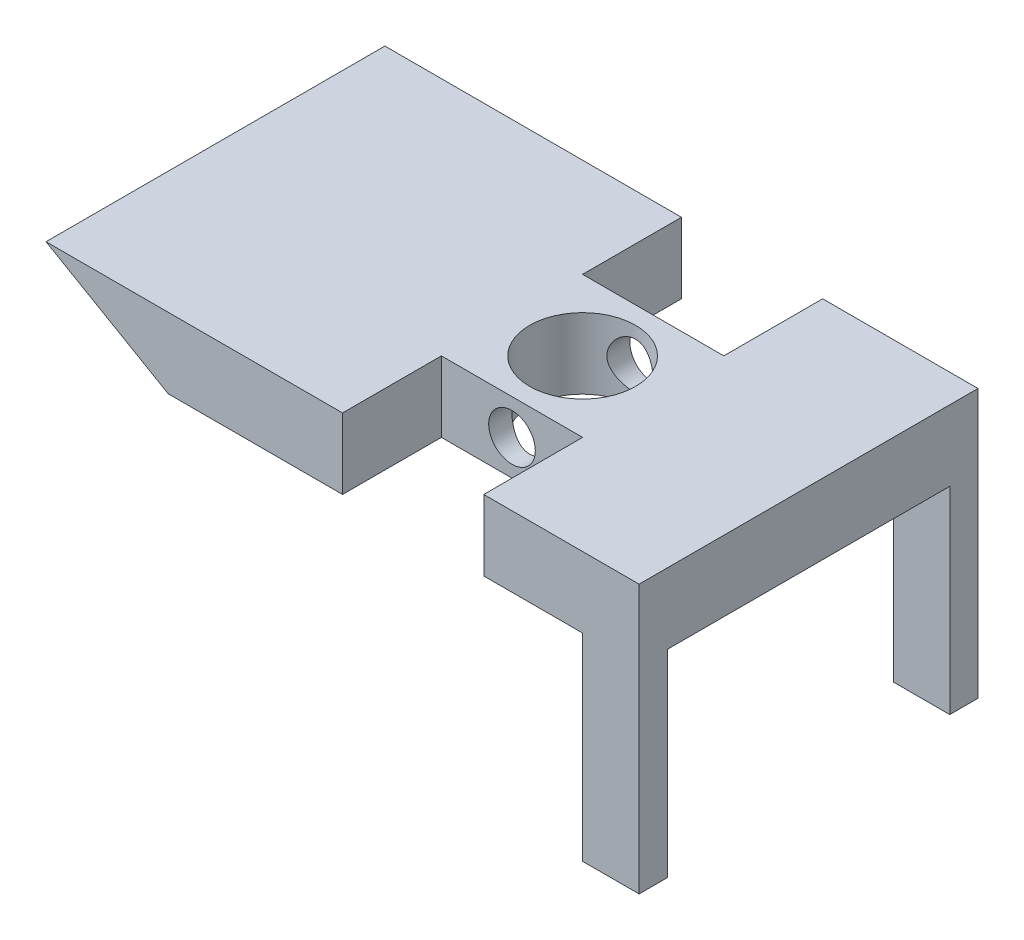
ISO-10303-21;
HEADER;
FILE_DESCRIPTION(('STEP AP214'),'2;1');
FILE_NAME('part.step','',(''),(''),'','','');
FILE_SCHEMA(('AUTOMOTIVE_DESIGN { 1 0 10303 214 1 1 1 1 }'));
ENDSEC;
DATA;
#1=APPLICATION_CONTEXT('core data for automotive mechanical design processes');
#2=APPLICATION_PROTOCOL_DEFINITION('international standard','automotive_design',2000,#1);
#3=PRODUCT_CONTEXT('',#1,'mechanical');
#4=PRODUCT('Part','Part','',(#3));
#5=PRODUCT_RELATED_PRODUCT_CATEGORY('part','',(#4));
#6=PRODUCT_DEFINITION_FORMATION('','',#4);
#7=PRODUCT_DEFINITION_CONTEXT('part definition',#1,'design');
#8=PRODUCT_DEFINITION('design','',#6,#7);
#9=PRODUCT_DEFINITION_SHAPE('','',#8);
#10=(LENGTH_UNIT() NAMED_UNIT(*) SI_UNIT(.MILLI.,.METRE.));
#11=(NAMED_UNIT(*) PLANE_ANGLE_UNIT() SI_UNIT($,.RADIAN.));
#12=(NAMED_UNIT(*) SI_UNIT($,.STERADIAN.) SOLID_ANGLE_UNIT());
#13=UNCERTAINTY_MEASURE_WITH_UNIT(LENGTH_MEASURE(1.E-05),#10,'distance_accuracy_value','');
#14=(GEOMETRIC_REPRESENTATION_CONTEXT(3) GLOBAL_UNCERTAINTY_ASSIGNED_CONTEXT((#13)) GLOBAL_UNIT_ASSIGNED_CONTEXT((#10,
#11,#12)) REPRESENTATION_CONTEXT('',''));
#15=CARTESIAN_POINT('',(0.,0.,0.));
#16=DIRECTION('',(0.,0.,1.));
#17=DIRECTION('',(1.,0.,0.));
#18=AXIS2_PLACEMENT_3D('',#15,#16,#17);
#19=CARTESIAN_POINT('',(17.,-16.5,-26.560219778561));
#20=DIRECTION('',(-1.,0.,0.));
#21=DIRECTION('',(0.,-1.,0.));
#22=AXIS2_PLACEMENT_3D('',#19,#20,#21);
#23=PLANE('',#22);
#24=DIRECTION('',(0.,1.,0.));
#25=VECTOR('',#24,1.);
#26=CARTESIAN_POINT('',(17.,-16.5,10.));
#27=LINE('',#26,#25);
#28=CARTESIAN_POINT('',(17.,-16.5,10.));
#29=VERTEX_POINT('',#28);
#30=CARTESIAN_POINT('',(17.,-2.50000000000001,10.));
#31=VERTEX_POINT('',#30);
#32=EDGE_CURVE('E262',#29,#31,#27,.T.);
#33=ORIENTED_EDGE('',*,*,#32,.F.);
#34=DIRECTION('',(0.,0.,1.));
#35=VECTOR('',#34,1.);
#36=CARTESIAN_POINT('',(17.,-16.5,-26.560219778561));
#37=LINE('',#36,#35);
#38=CARTESIAN_POINT('',(17.,-16.5,12.));
#39=VERTEX_POINT('',#38);
#40=EDGE_CURVE('E189',#29,#39,#37,.T.);
#41=ORIENTED_EDGE('',*,*,#40,.T.);
#42=DIRECTION('',(0.,-1.,0.));
#43=VECTOR('',#42,1.);
#44=CARTESIAN_POINT('',(17.,-16.5,12.));
#45=LINE('',#44,#43);
#46=CARTESIAN_POINT('',(17.,-2.50000000000001,12.));
#47=VERTEX_POINT('',#46);
#48=EDGE_CURVE('E264',#47,#39,#45,.T.);
#49=ORIENTED_EDGE('',*,*,#48,.F.);
#50=DIRECTION('',(0.,0.,1.));
#51=VECTOR('',#50,1.);
#52=CARTESIAN_POINT('',(17.,-2.50000000000001,-26.560219778561));
#53=LINE('',#52,#51);
#54=EDGE_CURVE('E69',#31,#47,#53,.T.);
#55=ORIENTED_EDGE('',*,*,#54,.F.);
#56=EDGE_LOOP('',(#33,#41,#49,#55));
#57=FACE_BOUND('',#56,.T.);
#58=ADVANCED_FACE('F45',(#57),#23,.T.);
#59=CARTESIAN_POINT('',(21.,-16.5,-26.560219778561));
#60=DIRECTION('',(0.,-1.,0.));
#61=DIRECTION('',(1.,0.,0.));
#62=AXIS2_PLACEMENT_3D('',#59,#60,#61);
#63=PLANE('',#62);
#64=DIRECTION('',(-1.,0.,0.));
#65=VECTOR('',#64,1.);
#66=CARTESIAN_POINT('',(21.,-16.5,10.));
#67=LINE('',#66,#65);
#68=CARTESIAN_POINT('',(21.,-16.5,10.));
#69=VERTEX_POINT('',#68);
#70=EDGE_CURVE('E11',#69,#29,#67,.T.);
#71=ORIENTED_EDGE('',*,*,#70,.F.);
#72=DIRECTION('',(0.,0.,1.));
#73=VECTOR('',#72,1.);
#74=CARTESIAN_POINT('',(21.,-16.5,-26.560219778561));
#75=LINE('',#74,#73);
#76=CARTESIAN_POINT('',(21.,-16.5,12.));
#77=VERTEX_POINT('',#76);
#78=EDGE_CURVE('E187',#69,#77,#75,.T.);
#79=ORIENTED_EDGE('',*,*,#78,.T.);
#80=DIRECTION('',(1.,0.,0.));
#81=VECTOR('',#80,1.);
#82=CARTESIAN_POINT('',(21.,-16.5,12.));
#83=LINE('',#82,#81);
#84=EDGE_CURVE('E269',#39,#77,#83,.T.);
#85=ORIENTED_EDGE('',*,*,#84,.F.);
#86=ORIENTED_EDGE('',*,*,#40,.F.);
#87=EDGE_LOOP('',(#71,#79,#85,#86));
#88=FACE_BOUND('',#87,.T.);
#89=ADVANCED_FACE('F185',(#88),#63,.T.);
#90=CARTESIAN_POINT('',(5.,0.,-12.001));
#91=DIRECTION('',(0.,0.,1.));
#92=DIRECTION('',(1.,0.,0.));
#93=AXIS2_PLACEMENT_3D('',#90,#91,#92);
#94=CYLINDRICAL_SURFACE('',#93,1.65);
#95=CARTESIAN_POINT('',(6.65,0.,-3.36749164809655));
#96=CARTESIAN_POINT('',(6.64999591948725,-0.0874743691332364,-3.36749607292385));
#97=CARTESIAN_POINT('',(6.64299960015496,-0.175092773934502,-3.37094939684784));
#98=CARTESIAN_POINT('',(6.61531716545798,-0.34775711686566,-3.38429832583538));
#99=CARTESIAN_POINT('',(6.59459592274656,-0.43279586708638,-3.39421046041475));
#100=CARTESIAN_POINT('',(6.54044870220548,-0.597493099250667,-3.41912171212209));
#101=CARTESIAN_POINT('',(6.50707857419381,-0.677173445386281,-3.43409843617774));
#102=CARTESIAN_POINT('',(6.42874832845569,-0.829783884986508,-3.46741736925901));
#103=CARTESIAN_POINT('',(6.38379002894348,-0.902715034980057,-3.48575905018413));
#104=CARTESIAN_POINT('',(6.28021734567749,-1.04487154765315,-3.52516638479344));
#105=CARTESIAN_POINT('',(6.22091990046756,-1.11357209474114,-3.54633091062051));
#106=CARTESIAN_POINT('',(6.09178303274802,-1.24044684009399,-3.5881911575404));
#107=CARTESIAN_POINT('',(6.02193928529622,-1.29861669819959,-3.60888668227713));
#108=CARTESIAN_POINT('',(5.86946484491625,-1.40556708343849,-3.64870271327509));
#109=CARTESIAN_POINT('',(5.78637319615618,-1.45374252984986,-3.66769507829858));
#110=CARTESIAN_POINT('',(5.61227632392994,-1.53520034882064,-3.700736202455));
#111=CARTESIAN_POINT('',(5.52127502438018,-1.5684900562803,-3.71478739560396));
#112=CARTESIAN_POINT('',(5.3394662745173,-1.61728382118504,-3.73565913311448));
#113=CARTESIAN_POINT('',(5.24894589824284,-1.63369687425848,-3.74284752867496));
#114=CARTESIAN_POINT('',(5.06617018053506,-1.65122350001048,-3.75052967187645));
#115=CARTESIAN_POINT('',(4.97391564874558,-1.65234404312534,-3.75102646959465));
#116=CARTESIAN_POINT('',(4.79695735459994,-1.63969762210196,-3.74547519866295));
#117=CARTESIAN_POINT('',(4.71216534970809,-1.6269337501266,-3.739868091581));
#118=CARTESIAN_POINT('',(4.5460705321449,-1.58862001141631,-3.72336083389609));
#119=CARTESIAN_POINT('',(4.46476797823857,-1.56306919822083,-3.71246029148675));
#120=CARTESIAN_POINT('',(4.30645273442336,-1.49962622377595,-3.68619520386884));
#121=CARTESIAN_POINT('',(4.22952453920683,-1.46155151512836,-3.67076501619212));
#122=CARTESIAN_POINT('',(4.08294686925941,-1.37433410623966,-3.63691910801703));
#123=CARTESIAN_POINT('',(4.01330005270581,-1.32518738450648,-3.6185023034251));
#124=CARTESIAN_POINT('',(3.87753504589473,-1.21281701199709,-3.57882020061428));
#125=CARTESIAN_POINT('',(3.81210572269681,-1.14879890575554,-3.5574447595915));
#126=CARTESIAN_POINT('',(3.69259260075723,-1.01070787762528,-3.51528240579217));
#127=CARTESIAN_POINT('',(3.63851423294623,-0.936630170451252,-3.49449577883282));
#128=CARTESIAN_POINT('',(3.54117220405855,-0.776800460066391,-3.45502479534648));
#129=CARTESIAN_POINT('',(3.49843008891747,-0.690699088400833,-3.43645839327868));
#130=CARTESIAN_POINT('',(3.42834028609234,-0.511490455495722,-3.40497856582965));
#131=CARTESIAN_POINT('',(3.40098013157646,-0.418388937355618,-3.39206056440346));
#132=CARTESIAN_POINT('',(3.36429227707904,-0.234744535363253,-3.37451456223478));
#133=CARTESIAN_POINT('',(3.35383875555708,-0.14447698815772,-3.36937064835984));
#134=CARTESIAN_POINT('',(3.34792333452705,0.0366498278836478,-3.36647574871939));
#135=CARTESIAN_POINT('',(3.35245516573098,0.127508833402355,-3.36872167133213));
#136=CARTESIAN_POINT('',(3.37535174013094,0.300038323378446,-3.37981562096985));
#137=CARTESIAN_POINT('',(3.39265374352297,0.381886932345077,-3.3881559621082));
#138=CARTESIAN_POINT('',(3.43914744636585,0.541431160999637,-3.40982287754369));
#139=CARTESIAN_POINT('',(3.46834214737761,0.619125726657332,-3.42315071054923));
#140=CARTESIAN_POINT('',(3.53921629690324,0.772027463841052,-3.45400682275722));
#141=CARTESIAN_POINT('',(3.58139272921155,0.846970827739329,-3.47169539316014));
#142=CARTESIAN_POINT('',(3.6765572613445,0.989101543315081,-3.50907546279441));
#143=CARTESIAN_POINT('',(3.72955038819797,1.05628526590527,-3.5287678911715));
#144=CARTESIAN_POINT('',(3.85062358980462,1.18748477509611,-3.57013856276202));
#145=CARTESIAN_POINT('',(3.9196470398001,1.25062896923803,-3.59183160476859));
#146=CARTESIAN_POINT('',(4.06778238636593,1.36462621623268,-3.63309467060809));
#147=CARTESIAN_POINT('',(4.14689558402023,1.41547768147165,-3.65266442003673));
#148=CARTESIAN_POINT('',(4.31400673932617,1.50362813045694,-3.68771558350776));
#149=CARTESIAN_POINT('',(4.40206664806587,1.54082304607772,-3.70316536765515));
#150=CARTESIAN_POINT('',(4.58405684732281,1.59956776607057,-3.72798894821772));
#151=CARTESIAN_POINT('',(4.6779831509097,1.62112807306508,-3.73736682301229));
#152=CARTESIAN_POINT('',(4.8612978165453,1.64656089333974,-3.74847245839303));
#153=CARTESIAN_POINT('',(4.95048512527525,1.65165818539736,-3.75072963755332));
#154=CARTESIAN_POINT('',(5.12843486064658,1.64739798838615,-3.74885512685435));
#155=CARTESIAN_POINT('',(5.21719737386056,1.63804358240265,-3.74472479968784));
#156=CARTESIAN_POINT('',(5.38782932587362,1.60602123171463,-3.7308324127445));
#157=CARTESIAN_POINT('',(5.46983114363675,1.58394115377817,-3.72131934376771));
#158=CARTESIAN_POINT('',(5.62890956243098,1.5277736246503,-3.69776205916142));
#159=CARTESIAN_POINT('',(5.70598528433432,1.493684037231,-3.68371703743449));
#160=CARTESIAN_POINT('',(5.8569304617613,1.41274147649753,-3.65162935021383));
#161=CARTESIAN_POINT('',(5.93049119711801,1.36537526372791,-3.63343300227536));
#162=CARTESIAN_POINT('',(6.06894266820481,1.25993695077241,-3.59513976322226));
#163=CARTESIAN_POINT('',(6.13382977719905,1.20186039623367,-3.57504208305736));
#164=CARTESIAN_POINT('',(6.25831260974055,1.07139703994961,-3.53324031823005));
#165=CARTESIAN_POINT('',(6.31711532685678,0.998252385431584,-3.51153178279635));
#166=CARTESIAN_POINT('',(6.42177534917193,0.842529476107379,-3.47047923678989));
#167=CARTESIAN_POINT('',(6.46762474174623,0.759945498298514,-3.45113667556083));
#168=CARTESIAN_POINT('',(6.5449162136947,0.587124299309078,-3.41723991894323));
#169=CARTESIAN_POINT('',(6.57632700235197,0.496870953906539,-3.40269614232787));
#170=CARTESIAN_POINT('',(6.62309555077018,0.311643517725821,-3.38064338773551));
#171=CARTESIAN_POINT('',(6.6385071714776,0.216686400884639,-3.3731108155642));
#172=CARTESIAN_POINT('',(6.64703108329939,0.100998496777651,-3.36894448238601));
#173=CARTESIAN_POINT('',(6.64814335262455,0.0808209970433329,-3.36840080987488));
#174=CARTESIAN_POINT('',(6.64962829144477,0.0404315640214873,-3.36767387701191));
#175=CARTESIAN_POINT('',(6.65000094320723,0.0202196299200109,-3.36749062530128));
#176=CARTESIAN_POINT('',(6.65,0.,-3.36749164809655));
#177=B_SPLINE_CURVE_WITH_KNOTS('',3,(#95,#96,#97,#98,#99,#100,#101,#102,#103,#104,#105,#106,
#107,#108,#109,#110,#111,#112,#113,#114,#115,#116,#117,#118,#119,#120,#121,#122,#123,#124,#125,
#126,#127,#128,#129,#130,#131,#132,#133,#134,#135,#136,#137,#138,#139,#140,#141,#142,#143,#144,
#145,#146,#147,#148,#149,#150,#151,#152,#153,#154,#155,#156,#157,#158,#159,#160,#161,#162,#163,
#164,#165,#166,#167,#168,#169,#170,#171,#172,#173,#174,#175,#176),.UNSPECIFIED.,.T.,.F.,(4,2,2,
2,2,2,2,2,2,2,2,2,2,2,2,2,2,2,2,2,2,2,2,2,2,2,2,2,2,2,2,2,2,2,2,2,2,2,2,2,4),(0.,
0.262337992001349,0.525350015511181,0.787214015160155,1.04903695265107,1.32739302247777,
1.60586355517072,1.89807751150631,2.19014732125288,2.46549872058573,2.74072460857159,
2.99731128459009,3.25391695538524,3.51444216606865,3.77506215572741,4.05582705551463,
4.336725984226,4.62890596840992,4.92084880275994,5.1924046605751,5.46384692437079,
5.71493513596501,5.96608675823259,6.22839495294345,6.49082533337074,6.77759301230099,
7.06439770769602,7.35334470453729,7.64209741960136,7.90880391080322,8.17545351143564,
8.43067328899048,8.68593848747794,8.95289970595717,9.21997220307097,9.50762420315226,
9.79545153931286,10.0838997352209,10.371373694431,10.4320114560409,10.4926506714452),.UNSPECIFIED.);
#178=CARTESIAN_POINT('',(6.65,0.,-3.36749164809655));
#179=VERTEX_POINT('',#178);
#180=EDGE_CURVE('E221',#179,#179,#177,.T.);
#181=ORIENTED_EDGE('',*,*,#180,.F.);
#182=EDGE_LOOP('',(#181));
#183=FACE_BOUND('',#182,.T.);
#184=CARTESIAN_POINT('',(5.,0.,-5.));
#185=DIRECTION('',(0.,0.,1.));
#186=DIRECTION('',(1.,0.,0.));
#187=AXIS2_PLACEMENT_3D('',#184,#185,#186);
#188=CIRCLE('',#187,1.65);
#189=CARTESIAN_POINT('',(6.65,0.,-5.));
#190=VERTEX_POINT('',#189);
#191=EDGE_CURVE('E398',#190,#190,#188,.T.);
#192=ORIENTED_EDGE('',*,*,#191,.F.);
#193=EDGE_LOOP('',(#192));
#194=FACE_BOUND('',#193,.T.);
#195=ADVANCED_FACE('F261',(#183,#194),#94,.F.);
#196=CARTESIAN_POINT('',(5.,-1.64999999999999,3.75));
#197=CARTESIAN_POINT('',(5.08794065243915,-1.6499960382256,3.74999677525689));
#198=CARTESIAN_POINT('',(5.17602118872723,-1.64292811014753,3.7468719189208));
#199=CARTESIAN_POINT('',(5.34965330491862,-1.61493414299231,3.734683166008));
#200=CARTESIAN_POINT('',(5.43519818666942,-1.59397431770862,3.72560479056562));
#201=CARTESIAN_POINT('',(5.60097235797528,-1.53913128450559,3.70247374212791));
#202=CARTESIAN_POINT('',(5.68121929706646,-1.50529382267499,3.68843868963418));
#203=CARTESIAN_POINT('',(5.83481096834596,-1.42585820871191,3.65674015300381));
#204=CARTESIAN_POINT('',(5.90815735131847,-1.38026287916685,3.63907753990429));
#205=CARTESIAN_POINT('',(6.05000163649843,-1.27598104842034,3.60078615738986));
#206=CARTESIAN_POINT('',(6.1180736642644,-1.21675391782858,3.58005322837619));
#207=CARTESIAN_POINT('',(6.2436925761984,-1.08803679555133,3.53837779505836));
#208=CARTESIAN_POINT('',(6.30123331014303,-1.01854084946944,3.51743517577732));
#209=CARTESIAN_POINT('',(6.40737198125606,-0.866527492523985,3.47638120662905));
#210=CARTESIAN_POINT('',(6.45528386928225,-0.783497192018419,3.45638307676996));
#211=CARTESIAN_POINT('',(6.53627172599083,-0.609555260312099,3.4211597332649));
#212=CARTESIAN_POINT('',(6.5693561919984,-0.51864817889095,3.40593178742375));
#213=CARTESIAN_POINT('',(6.61794121689661,-0.336431274272974,3.3831135312385));
#214=CARTESIAN_POINT('',(6.63426566626132,-0.24538750145579,3.37516767353209));
#215=CARTESIAN_POINT('',(6.65143054751147,-0.061533346194549,3.3668053594707));
#216=CARTESIAN_POINT('',(6.65228100759649,0.0312758530848601,3.36638402671406));
#217=CARTESIAN_POINT('',(6.63908919688508,0.207355873544236,3.37282106403821));
#218=CARTESIAN_POINT('',(6.62634141864489,0.290751689794511,3.37904671722602));
#219=CARTESIAN_POINT('',(6.58850520692874,0.454071225614284,3.39699646382115));
#220=CARTESIAN_POINT('',(6.56341407162607,0.533994180841903,3.40872176101459));
#221=CARTESIAN_POINT('',(6.50110649630304,0.690226926082295,3.43662073577462));
#222=CARTESIAN_POINT('',(6.46363227970243,0.766416489003962,3.45288773136686));
#223=CARTESIAN_POINT('',(6.37780710670808,0.911743878376047,3.48802159021638));
#224=CARTESIAN_POINT('',(6.32945161231713,0.98087874515625,3.50688953691532));
#225=CARTESIAN_POINT('',(6.21783776896922,1.11706798335261,3.54728261097474));
#226=CARTESIAN_POINT('',(6.15359849475329,1.18329659100237,3.56888963165699));
#227=CARTESIAN_POINT('',(6.01473808953318,1.30433611063187,3.61082599340459));
#228=CARTESIAN_POINT('',(5.94011395212262,1.35914370472461,3.63115496199219));
#229=CARTESIAN_POINT('',(5.77984544173489,1.4571919003997,3.66896451776514));
#230=CARTESIAN_POINT('',(5.69394811565675,1.50005943159357,3.68634771561839));
#231=CARTESIAN_POINT('',(5.51519989197507,1.57043908051861,3.71554130843415));
#232=CARTESIAN_POINT('',(5.42235333017465,1.59796068385572,3.72735514522372));
#233=CARTESIAN_POINT('',(5.23921022750967,1.63505304083378,3.74341295596741));
#234=CARTESIAN_POINT('',(5.14917854061996,1.64572966452199,3.74812228788192));
#235=CARTESIAN_POINT('',(4.96849247665594,1.65217171911426,3.75095455785044));
#236=CARTESIAN_POINT('',(4.87783831540074,1.64794208106069,3.74907967398628));
#237=CARTESIAN_POINT('',(4.70390665287527,1.62544881834209,3.73925037459651));
#238=CARTESIAN_POINT('',(4.62050230959725,1.60799437581935,3.73164663418775));
#239=CARTESIAN_POINT('',(4.45791706209694,1.56071027218964,3.71151728629914));
#240=CARTESIAN_POINT('',(4.37873667607145,1.5308790966223,3.69899107649862));
#241=CARTESIAN_POINT('',(4.22404079862631,1.45873229578338,3.66971134498956));
#242=CARTESIAN_POINT('',(4.14871703627141,1.41605581574278,3.65283800179973));
#243=CARTESIAN_POINT('',(4.00602810222664,1.31982329381418,3.61662102234894));
#244=CARTESIAN_POINT('',(3.93866640117434,1.26626253496258,3.5972763164179));
#245=CARTESIAN_POINT('',(3.80819611837273,1.14484038573233,3.55628214760162));
#246=CARTESIAN_POINT('',(3.74584598439284,1.07618271743489,3.53457144282308));
#247=CARTESIAN_POINT('',(3.63330445356358,0.929097206857137,3.49260064747062));
#248=CARTESIAN_POINT('',(3.58311709508679,0.850666132592157,3.47234104026914));
#249=CARTESIAN_POINT('',(3.49540307748589,0.683921591275967,3.43526035744153));
#250=CARTESIAN_POINT('',(3.45817723591055,0.595429542818641,3.4185241503665));
#251=CARTESIAN_POINT('',(3.39950438017547,0.412456963898673,3.39145640297362));
#252=CARTESIAN_POINT('',(3.37804232181517,0.317982236816925,3.38111875766089));
#253=CARTESIAN_POINT('',(3.35307874998712,0.134229339541123,3.36902436868046));
#254=CARTESIAN_POINT('',(3.34822601990919,0.0451768053067911,3.36662264808986));
#255=CARTESIAN_POINT('',(3.35292803694661,-0.132443324028015,3.36892598901368));
#256=CARTESIAN_POINT('',(3.36247987258739,-0.221011013494947,3.37362961438418));
#257=CARTESIAN_POINT('',(3.39454415171674,-0.389834130472378,3.38899632048544));
#258=CARTESIAN_POINT('',(3.41627535473376,-0.470274087988884,3.39929913530275));
#259=CARTESIAN_POINT('',(3.4712672768033,-0.626361280798586,3.42438089295876));
#260=CARTESIAN_POINT('',(3.50453131275969,-0.702007129869665,3.43916112337134));
#261=CARTESIAN_POINT('',(3.58406507679427,-0.851619735953297,3.47269356886383));
#262=CARTESIAN_POINT('',(3.63102681157857,-0.925174495154689,3.49163847278619));
#263=CARTESIAN_POINT('',(3.7357127896172,-1.06377992281055,3.53089238653571));
#264=CARTESIAN_POINT('',(3.79344141213049,-1.12882711256768,3.55120194925799));
#265=CARTESIAN_POINT('',(3.92382903951875,-1.25428003578286,3.59296880703805));
#266=CARTESIAN_POINT('',(3.99734015606778,-1.31382091586416,3.6143768693599));
#267=CARTESIAN_POINT('',(4.15406955877593,-1.41980560454865,3.65423468677977));
#268=CARTESIAN_POINT('',(4.23729223810856,-1.46624345307614,3.67268309400139));
#269=CARTESIAN_POINT('',(4.41023740744423,-1.54387701756613,3.70436408768263));
#270=CARTESIAN_POINT('',(4.49986734754799,-1.57525320509646,3.71765804406783));
#271=CARTESIAN_POINT('',(4.68371482188615,-1.62216171678276,3.73777368374933));
#272=CARTESIAN_POINT('',(4.77791736039553,-1.63774259010251,3.74461519501638));
#273=CARTESIAN_POINT('',(4.89387606102141,-1.64672172070878,3.7485588513459));
#274=CARTESIAN_POINT('',(4.91507632147087,-1.64794995964318,3.74909837906909));
#275=CARTESIAN_POINT('',(4.95751499929637,-1.6495895819625,3.74981934473969));
#276=CARTESIAN_POINT('',(4.97875341705226,-1.65000095717015,3.75000077910238));
#277=CARTESIAN_POINT('',(5.,-1.64999999999999,3.75));
#278=B_SPLINE_CURVE_WITH_KNOTS('',3,(#196,#197,#198,#199,#200,#201,#202,#203,#204,#205,#206,
#207,#208,#209,#210,#211,#212,#213,#214,#215,#216,#217,#218,#219,#220,#221,#222,#223,#224,#225,
#226,#227,#228,#229,#230,#231,#232,#233,#234,#235,#236,#237,#238,#239,#240,#241,#242,#243,#244,
#245,#246,#247,#248,#249,#250,#251,#252,#253,#254,#255,#256,#257,#258,#259,#260,#261,#262,#263,
#264,#265,#266,#267,#268,#269,#270,#271,#272,#273,#274,#275,#276,#277),.UNSPECIFIED.,.T.,.F.,(4,
2,2,2,2,2,2,2,2,2,2,2,2,2,2,2,2,2,2,2,2,2,2,2,2,2,2,2,2,2,2,2,2,2,2,2,2,2,2,2,4),(0.,
0.263734510147989,0.528112809050451,0.791560575603076,1.05494515780488,1.33150079465859,
1.60821742685178,1.90051649596436,2.19264783893791,2.46960925800041,2.74639118079142,
2.99899429642278,3.25165272874969,3.50994222706956,3.76833964437948,4.05135561937526,
4.33445369828947,4.62559874662744,4.91656363268483,5.18748705235547,5.45832085804592,
5.71380105020368,5.96931251303603,6.23280504553125,6.49641201330446,6.78088013255853,
7.06544257396593,7.35622693243307,7.64673341835486,7.91295937269032,8.17913152420861,
8.42991502344918,8.68077070926695,8.94756356427704,9.21446517058845,9.50405959505639,
9.79378553355286,10.0799474542432,10.3652271238324,10.4289451074685,10.4926637289549),.UNSPECIFIED.);
#279=CARTESIAN_POINT('',(5.,-1.64999999999999,3.75));
#280=VERTEX_POINT('',#279);
#281=EDGE_CURVE('E230',#280,#280,#278,.T.);
#282=ORIENTED_EDGE('',*,*,#281,.F.);
#283=EDGE_LOOP('',(#282));
#284=FACE_BOUND('',#283,.T.);
#285=CARTESIAN_POINT('',(5.,0.,5.));
#286=DIRECTION('',(0.,0.,1.));
#287=DIRECTION('',(1.,0.,0.));
#288=AXIS2_PLACEMENT_3D('',#285,#286,#287);
#289=CIRCLE('',#288,1.65);
#290=CARTESIAN_POINT('',(6.65,0.,5.));
#291=VERTEX_POINT('',#290);
#292=EDGE_CURVE('E357',#291,#291,#289,.T.);
#293=ORIENTED_EDGE('',*,*,#292,.T.);
#294=EDGE_LOOP('',(#293));
#295=FACE_BOUND('',#294,.T.);
#296=ADVANCED_FACE('F420',(#284,#295),#94,.F.);
#297=CARTESIAN_POINT('',(-21.,2.50000000000001,12.));
#298=DIRECTION('',(0.,-1.,0.));
#299=DIRECTION('',(1.,0.,0.));
#300=AXIS2_PLACEMENT_3D('',#297,#298,#299);
#301=PLANE('',#300);
#302=CARTESIAN_POINT('',(5.,2.5,0.));
#303=DIRECTION('',(0.,1.,0.));
#304=DIRECTION('',(0.,0.,1.));
#305=AXIS2_PLACEMENT_3D('',#302,#303,#304);
#306=CIRCLE('',#305,3.75);
#307=CARTESIAN_POINT('',(5.,2.5,3.75));
#308=VERTEX_POINT('',#307);
#309=EDGE_CURVE('E213',#308,#308,#306,.T.);
#310=ORIENTED_EDGE('',*,*,#309,.F.);
#311=EDGE_LOOP('',(#310));
#312=FACE_BOUND('',#311,.T.);
#313=DIRECTION('',(0.,0.,-1.));
#314=VECTOR('',#313,1.);
#315=CARTESIAN_POINT('',(0.,2.50000000000001,-5.));
#316=LINE('',#315,#314);
#317=CARTESIAN_POINT('',(0.,2.50000000000001,-5.));
#318=VERTEX_POINT('',#317);
#319=CARTESIAN_POINT('',(0.,2.50000000000001,-12.));
#320=VERTEX_POINT('',#319);
#321=EDGE_CURVE('E376',#318,#320,#316,.T.);
#322=ORIENTED_EDGE('',*,*,#321,.T.);
#323=DIRECTION('',(-1.,0.,0.));
#324=VECTOR('',#323,1.);
#325=CARTESIAN_POINT('',(-21.,2.50000000000001,-12.));
#326=LINE('',#325,#324);
#327=CARTESIAN_POINT('',(-21.,2.50000000000001,-12.));
#328=VERTEX_POINT('',#327);
#329=EDGE_CURVE('E318',#320,#328,#326,.T.);
#330=ORIENTED_EDGE('',*,*,#329,.T.);
#331=DIRECTION('',(0.,0.,-1.));
#332=VECTOR('',#331,1.);
#333=CARTESIAN_POINT('',(-21.,2.50000000000001,12.));
#334=LINE('',#333,#332);
#335=CARTESIAN_POINT('',(-21.,2.50000000000001,12.));
#336=VERTEX_POINT('',#335);
#337=EDGE_CURVE('E296',#336,#328,#334,.T.);
#338=ORIENTED_EDGE('',*,*,#337,.F.);
#339=DIRECTION('',(-1.,0.,0.));
#340=VECTOR('',#339,1.);
#341=CARTESIAN_POINT('',(-21.,2.50000000000001,12.));
#342=LINE('',#341,#340);
#343=CARTESIAN_POINT('',(0.,2.50000000000001,12.));
#344=VERTEX_POINT('',#343);
#345=EDGE_CURVE('E333',#344,#336,#342,.T.);
#346=ORIENTED_EDGE('',*,*,#345,.F.);
#347=DIRECTION('',(0.,0.,1.));
#348=VECTOR('',#347,1.);
#349=CARTESIAN_POINT('',(0.,2.50000000000001,5.));
#350=LINE('',#349,#348);
#351=CARTESIAN_POINT('',(0.,2.50000000000001,5.));
#352=VERTEX_POINT('',#351);
#353=EDGE_CURVE('E321',#352,#344,#350,.T.);
#354=ORIENTED_EDGE('',*,*,#353,.F.);
#355=DIRECTION('',(-1.,0.,0.));
#356=VECTOR('',#355,1.);
#357=CARTESIAN_POINT('',(9.99999999999999,2.50000000000001,5.));
#358=LINE('',#357,#356);
#359=CARTESIAN_POINT('',(9.99999999999999,2.50000000000001,5.));
#360=VERTEX_POINT('',#359);
#361=EDGE_CURVE('E341',#360,#352,#358,.T.);
#362=ORIENTED_EDGE('',*,*,#361,.F.);
#363=DIRECTION('',(0.,0.,1.));
#364=VECTOR('',#363,1.);
#365=CARTESIAN_POINT('',(9.99999999999999,2.50000000000001,5.));
#366=LINE('',#365,#364);
#367=CARTESIAN_POINT('',(9.99999999999999,2.50000000000001,12.));
#368=VERTEX_POINT('',#367);
#369=EDGE_CURVE('E344',#360,#368,#366,.T.);
#370=ORIENTED_EDGE('',*,*,#369,.T.);
#371=CARTESIAN_POINT('',(21.,2.49999999999999,12.));
#372=VERTEX_POINT('',#371);
#373=EDGE_CURVE('E329',#372,#368,#342,.T.);
#374=ORIENTED_EDGE('',*,*,#373,.F.);
#375=DIRECTION('',(0.,0.,-1.));
#376=VECTOR('',#375,1.);
#377=CARTESIAN_POINT('',(21.,2.49999999999999,12.));
#378=LINE('',#377,#376);
#379=CARTESIAN_POINT('',(21.,2.49999999999999,-12.));
#380=VERTEX_POINT('',#379);
#381=EDGE_CURVE('E293',#372,#380,#378,.T.);
#382=ORIENTED_EDGE('',*,*,#381,.T.);
#383=CARTESIAN_POINT('',(9.99999999999999,2.49999999999999,-12.));
#384=VERTEX_POINT('',#383);
#385=EDGE_CURVE('E314',#380,#384,#326,.T.);
#386=ORIENTED_EDGE('',*,*,#385,.T.);
#387=DIRECTION('',(0.,0.,-1.));
#388=VECTOR('',#387,1.);
#389=CARTESIAN_POINT('',(9.99999999999999,2.50000000000001,-5.));
#390=LINE('',#389,#388);
#391=CARTESIAN_POINT('',(9.99999999999999,2.50000000000001,-5.));
#392=VERTEX_POINT('',#391);
#393=EDGE_CURVE('E380',#392,#384,#390,.T.);
#394=ORIENTED_EDGE('',*,*,#393,.F.);
#395=DIRECTION('',(-1.,0.,0.));
#396=VECTOR('',#395,1.);
#397=CARTESIAN_POINT('',(9.99999999999999,2.50000000000001,-5.));
#398=LINE('',#397,#396);
#399=EDGE_CURVE('E405',#392,#318,#398,.T.);
#400=ORIENTED_EDGE('',*,*,#399,.T.);
#401=EDGE_LOOP('',(#322,#330,#338,#346,#354,#362,#370,#374,#382,#386,#394,#400));
#402=FACE_BOUND('',#401,.T.);
#403=ADVANCED_FACE('F423',(#312,#402),#301,.F.);
#404=CARTESIAN_POINT('',(-12.3397459621556,-2.50000000000001,12.));
#405=DIRECTION('',(0.,1.,0.));
#406=DIRECTION('',(0.,0.,1.));
#407=AXIS2_PLACEMENT_3D('',#404,#405,#406);
#408=PLANE('',#407);
#409=DIRECTION('',(1.,0.,0.));
#410=VECTOR('',#409,1.);
#411=CARTESIAN_POINT('',(11.,-2.5,10.));
#412=LINE('',#411,#410);
#413=CARTESIAN_POINT('',(21.,-2.50000000000002,10.));
#414=VERTEX_POINT('',#413);
#415=EDGE_CURVE('E175',#31,#414,#412,.T.);
#416=ORIENTED_EDGE('',*,*,#415,.F.);
#417=ORIENTED_EDGE('',*,*,#54,.T.);
#418=DIRECTION('',(1.,0.,0.));
#419=VECTOR('',#418,1.);
#420=CARTESIAN_POINT('',(-12.3397459621556,-2.50000000000001,12.));
#421=LINE('',#420,#419);
#422=CARTESIAN_POINT('',(10.,-2.50000000000001,12.));
#423=VERTEX_POINT('',#422);
#424=EDGE_CURVE('E325',#423,#47,#421,.T.);
#425=ORIENTED_EDGE('',*,*,#424,.F.);
#426=DIRECTION('',(0.,0.,1.));
#427=VECTOR('',#426,1.);
#428=CARTESIAN_POINT('',(9.99999999999999,-2.49999999999999,5.));
#429=LINE('',#428,#427);
#430=CARTESIAN_POINT('',(9.99999999999999,-2.49999999999999,5.));
#431=VERTEX_POINT('',#430);
#432=EDGE_CURVE('E340',#431,#423,#429,.T.);
#433=ORIENTED_EDGE('',*,*,#432,.F.);
#434=DIRECTION('',(1.,0.,0.));
#435=VECTOR('',#434,1.);
#436=CARTESIAN_POINT('',(9.99999999999999,-2.49999999999999,5.));
#437=LINE('',#436,#435);
#438=CARTESIAN_POINT('',(0.,-2.49999999999999,5.));
#439=VERTEX_POINT('',#438);
#440=EDGE_CURVE('E365',#439,#431,#437,.T.);
#441=ORIENTED_EDGE('',*,*,#440,.F.);
#442=DIRECTION('',(0.,0.,1.));
#443=VECTOR('',#442,1.);
#444=CARTESIAN_POINT('',(0.,-2.49999999999999,5.));
#445=LINE('',#444,#443);
#446=CARTESIAN_POINT('',(0.,-2.49999999999999,12.));
#447=VERTEX_POINT('',#446);
#448=EDGE_CURVE('E336',#439,#447,#445,.T.);
#449=ORIENTED_EDGE('',*,*,#448,.T.);
#450=CARTESIAN_POINT('',(-12.3397459621556,-2.50000000000001,12.));
#451=VERTEX_POINT('',#450);
#452=EDGE_CURVE('E306',#451,#447,#421,.T.);
#453=ORIENTED_EDGE('',*,*,#452,.F.);
#454=DIRECTION('',(0.,0.,-1.));
#455=VECTOR('',#454,1.);
#456=CARTESIAN_POINT('',(-12.3397459621556,-2.50000000000001,12.));
#457=LINE('',#456,#455);
#458=CARTESIAN_POINT('',(-12.3397459621556,-2.50000000000001,-12.));
#459=VERTEX_POINT('',#458);
#460=EDGE_CURVE('E302',#451,#459,#457,.T.);
#461=ORIENTED_EDGE('',*,*,#460,.T.);
#462=DIRECTION('',(1.,0.,0.));
#463=VECTOR('',#462,1.);
#464=CARTESIAN_POINT('',(-12.3397459621556,-2.50000000000001,-12.));
#465=LINE('',#464,#463);
#466=CARTESIAN_POINT('',(0.,-2.49999999999999,-12.));
#467=VERTEX_POINT('',#466);
#468=EDGE_CURVE('E307',#459,#467,#465,.T.);
#469=ORIENTED_EDGE('',*,*,#468,.T.);
#470=DIRECTION('',(0.,0.,-1.));
#471=VECTOR('',#470,1.);
#472=CARTESIAN_POINT('',(0.,-2.49999999999999,-5.));
#473=LINE('',#472,#471);
#474=CARTESIAN_POINT('',(0.,-2.49999999999999,-5.));
#475=VERTEX_POINT('',#474);
#476=EDGE_CURVE('E375',#475,#467,#473,.T.);
#477=ORIENTED_EDGE('',*,*,#476,.F.);
#478=DIRECTION('',(1.,0.,0.));
#479=VECTOR('',#478,1.);
#480=CARTESIAN_POINT('',(9.99999999999999,-2.49999999999999,-5.));
#481=LINE('',#480,#479);
#482=CARTESIAN_POINT('',(9.99999999999999,-2.49999999999999,-5.));
#483=VERTEX_POINT('',#482);
#484=EDGE_CURVE('E381',#475,#483,#481,.T.);
#485=ORIENTED_EDGE('',*,*,#484,.T.);
#486=DIRECTION('',(0.,0.,-1.));
#487=VECTOR('',#486,1.);
#488=CARTESIAN_POINT('',(9.99999999999999,-2.49999999999999,-5.));
#489=LINE('',#488,#487);
#490=CARTESIAN_POINT('',(9.99999999999999,-2.49999999999999,-12.));
#491=VERTEX_POINT('',#490);
#492=EDGE_CURVE('E384',#483,#491,#489,.T.);
#493=ORIENTED_EDGE('',*,*,#492,.T.);
#494=CARTESIAN_POINT('',(17.,-2.50000000000001,-12.));
#495=VERTEX_POINT('',#494);
#496=EDGE_CURVE('E286',#491,#495,#465,.T.);
#497=ORIENTED_EDGE('',*,*,#496,.T.);
#498=CARTESIAN_POINT('',(17.,-2.50000000000001,-10.));
#499=VERTEX_POINT('',#498);
#500=EDGE_CURVE('E209',#495,#499,#53,.T.);
#501=ORIENTED_EDGE('',*,*,#500,.T.);
#502=DIRECTION('',(1.,0.,0.));
#503=VECTOR('',#502,1.);
#504=CARTESIAN_POINT('',(11.,-2.5,-10.));
#505=LINE('',#504,#503);
#506=CARTESIAN_POINT('',(21.,-2.50000000000002,-10.));
#507=VERTEX_POINT('',#506);
#508=EDGE_CURVE('E653',#499,#507,#505,.T.);
#509=ORIENTED_EDGE('',*,*,#508,.T.);
#510=DIRECTION('',(0.,0.,1.));
#511=VECTOR('',#510,1.);
#512=CARTESIAN_POINT('',(21.,-2.50000000000002,10.));
#513=LINE('',#512,#511);
#514=EDGE_CURVE('E654',#507,#414,#513,.T.);
#515=ORIENTED_EDGE('',*,*,#514,.T.);
#516=EDGE_LOOP('',(#416,#417,#425,#433,#441,#449,#453,#461,#469,#477,#485,#493,#497,#501,#509,#515));
#517=FACE_BOUND('',#516,.T.);
#518=CARTESIAN_POINT('',(5.,-2.50000000000001,0.));
#519=DIRECTION('',(0.,1.,0.));
#520=DIRECTION('',(0.,0.,1.));
#521=AXIS2_PLACEMENT_3D('',#518,#519,#520);
#522=CIRCLE('',#521,3.75);
#523=CARTESIAN_POINT('',(5.,-2.50000000000001,3.75));
#524=VERTEX_POINT('',#523);
#525=EDGE_CURVE('E217',#524,#524,#522,.F.);
#526=ORIENTED_EDGE('',*,*,#525,.F.);
#527=EDGE_LOOP('',(#526));
#528=FACE_BOUND('',#527,.T.);
#529=ADVANCED_FACE('F438',(#517,#528),#408,.F.);
#530=CARTESIAN_POINT('',(0.,0.,-12.));
#531=DIRECTION('',(0.,0.,-1.));
#532=DIRECTION('',(-1.,0.,0.));
#533=AXIS2_PLACEMENT_3D('',#530,#531,#532);
#534=PLANE('',#533);
#535=ORIENTED_EDGE('',*,*,#329,.F.);
#536=DIRECTION('',(0.,-1.,0.));
#537=VECTOR('',#536,1.);
#538=CARTESIAN_POINT('',(0.,-2.49999999999999,-12.));
#539=LINE('',#538,#537);
#540=EDGE_CURVE('E394',#320,#467,#539,.T.);
#541=ORIENTED_EDGE('',*,*,#540,.T.);
#542=ORIENTED_EDGE('',*,*,#468,.F.);
#543=DIRECTION('',(0.866025403784438,-0.500000000000001,0.));
#544=VECTOR('',#543,1.);
#545=CARTESIAN_POINT('',(-21.,2.50000000000001,-12.));
#546=LINE('',#545,#544);
#547=EDGE_CURVE('E311',#328,#459,#546,.T.);
#548=ORIENTED_EDGE('',*,*,#547,.F.);
#549=EDGE_LOOP('',(#535,#541,#542,#548));
#550=FACE_BOUND('',#549,.T.);
#551=ADVANCED_FACE('F461',(#550),#534,.T.);
#552=ORIENTED_EDGE('',*,*,#496,.F.);
#553=DIRECTION('',(0.,1.,0.));
#554=VECTOR('',#553,1.);
#555=CARTESIAN_POINT('',(9.99999999999999,-2.49999999999999,-12.));
#556=LINE('',#555,#554);
#557=EDGE_CURVE('E390',#491,#384,#556,.T.);
#558=ORIENTED_EDGE('',*,*,#557,.T.);
#559=ORIENTED_EDGE('',*,*,#385,.F.);
#560=DIRECTION('',(0.,1.,0.));
#561=VECTOR('',#560,1.);
#562=CARTESIAN_POINT('',(21.,-2.50000000000001,-12.));
#563=LINE('',#562,#561);
#564=CARTESIAN_POINT('',(21.,-16.5,-12.));
#565=VERTEX_POINT('',#564);
#566=EDGE_CURVE('E288',#565,#380,#563,.T.);
#567=ORIENTED_EDGE('',*,*,#566,.F.);
#568=DIRECTION('',(1.,0.,0.));
#569=VECTOR('',#568,1.);
#570=CARTESIAN_POINT('',(21.,-16.5,-12.));
#571=LINE('',#570,#569);
#572=CARTESIAN_POINT('',(17.,-16.5,-12.));
#573=VERTEX_POINT('',#572);
#574=EDGE_CURVE('E196',#573,#565,#571,.T.);
#575=ORIENTED_EDGE('',*,*,#574,.F.);
#576=DIRECTION('',(0.,-1.,0.));
#577=VECTOR('',#576,1.);
#578=CARTESIAN_POINT('',(17.,-16.5,-12.));
#579=LINE('',#578,#577);
#580=EDGE_CURVE('E275',#495,#573,#579,.T.);
#581=ORIENTED_EDGE('',*,*,#580,.F.);
#582=EDGE_LOOP('',(#552,#558,#559,#567,#575,#581));
#583=FACE_BOUND('',#582,.T.);
#584=ADVANCED_FACE('F284',(#583),#534,.T.);
#585=CARTESIAN_POINT('',(0.,0.,12.));
#586=DIRECTION('',(0.,0.,-1.));
#587=DIRECTION('',(-1.,0.,0.));
#588=AXIS2_PLACEMENT_3D('',#585,#586,#587);
#589=PLANE('',#588);
#590=ORIENTED_EDGE('',*,*,#452,.T.);
#591=DIRECTION('',(0.,-1.,0.));
#592=VECTOR('',#591,1.);
#593=CARTESIAN_POINT('',(0.,-2.49999999999999,12.));
#594=LINE('',#593,#592);
#595=EDGE_CURVE('E354',#344,#447,#594,.T.);
#596=ORIENTED_EDGE('',*,*,#595,.F.);
#597=ORIENTED_EDGE('',*,*,#345,.T.);
#598=DIRECTION('',(0.866025403784438,-0.500000000000001,0.));
#599=VECTOR('',#598,1.);
#600=CARTESIAN_POINT('',(-21.,2.50000000000001,12.));
#601=LINE('',#600,#599);
#602=EDGE_CURVE('E326',#336,#451,#601,.T.);
#603=ORIENTED_EDGE('',*,*,#602,.T.);
#604=EDGE_LOOP('',(#590,#596,#597,#603));
#605=FACE_BOUND('',#604,.T.);
#606=ADVANCED_FACE('F452',(#605),#589,.F.);
#607=CARTESIAN_POINT('',(21.,-2.50000000000001,12.));
#608=DIRECTION('',(-1.,0.,0.));
#609=DIRECTION('',(0.,-1.,0.));
#610=AXIS2_PLACEMENT_3D('',#607,#608,#609);
#611=PLANE('',#610);
#612=ORIENTED_EDGE('',*,*,#78,.F.);
#613=DIRECTION('',(0.,-1.,0.));
#614=VECTOR('',#613,1.);
#615=CARTESIAN_POINT('',(21.,-16.5,10.));
#616=LINE('',#615,#614);
#617=EDGE_CURVE('E171',#414,#69,#616,.T.);
#618=ORIENTED_EDGE('',*,*,#617,.F.);
#619=ORIENTED_EDGE('',*,*,#514,.F.);
#620=DIRECTION('',(0.,1.,0.));
#621=VECTOR('',#620,1.);
#622=CARTESIAN_POINT('',(21.,-16.5,-10.));
#623=LINE('',#622,#621);
#624=CARTESIAN_POINT('',(21.,-16.5,-10.));
#625=VERTEX_POINT('',#624);
#626=EDGE_CURVE('E181',#625,#507,#623,.T.);
#627=ORIENTED_EDGE('',*,*,#626,.F.);
#628=EDGE_CURVE('E195',#565,#625,#75,.T.);
#629=ORIENTED_EDGE('',*,*,#628,.F.);
#630=ORIENTED_EDGE('',*,*,#566,.T.);
#631=ORIENTED_EDGE('',*,*,#381,.F.);
#632=DIRECTION('',(0.,1.,0.));
#633=VECTOR('',#632,1.);
#634=CARTESIAN_POINT('',(21.,-2.50000000000001,12.));
#635=LINE('',#634,#633);
#636=EDGE_CURVE('E192',#77,#372,#635,.T.);
#637=ORIENTED_EDGE('',*,*,#636,.F.);
#638=EDGE_LOOP('',(#612,#618,#619,#627,#629,#630,#631,#637));
#639=FACE_BOUND('',#638,.T.);
#640=ADVANCED_FACE('F47',(#639),#611,.F.);
#641=CARTESIAN_POINT('',(-21.,2.50000000000001,12.));
#642=DIRECTION('',(0.500000000000001,0.866025403784438,0.));
#643=DIRECTION('',(-0.866025403784438,0.500000000000001,0.));
#644=AXIS2_PLACEMENT_3D('',#641,#642,#643);
#645=PLANE('',#644);
#646=ORIENTED_EDGE('',*,*,#547,.T.);
#647=ORIENTED_EDGE('',*,*,#460,.F.);
#648=ORIENTED_EDGE('',*,*,#602,.F.);
#649=ORIENTED_EDGE('',*,*,#337,.T.);
#650=EDGE_LOOP('',(#646,#647,#648,#649));
#651=FACE_BOUND('',#650,.T.);
#652=ADVANCED_FACE('F486',(#651),#645,.F.);
#653=ORIENTED_EDGE('',*,*,#373,.T.);
#654=DIRECTION('',(0.,1.,0.));
#655=VECTOR('',#654,1.);
#656=CARTESIAN_POINT('',(9.99999999999999,-2.49999999999999,12.));
#657=LINE('',#656,#655);
#658=EDGE_CURVE('E350',#423,#368,#657,.T.);
#659=ORIENTED_EDGE('',*,*,#658,.F.);
#660=ORIENTED_EDGE('',*,*,#424,.T.);
#661=ORIENTED_EDGE('',*,*,#48,.T.);
#662=ORIENTED_EDGE('',*,*,#84,.T.);
#663=ORIENTED_EDGE('',*,*,#636,.T.);
#664=EDGE_LOOP('',(#653,#659,#660,#661,#662,#663));
#665=FACE_BOUND('',#664,.T.);
#666=ADVANCED_FACE('F445',(#665),#589,.F.);
#667=CARTESIAN_POINT('',(0.,-2.49999999999999,5.));
#668=DIRECTION('',(-1.,0.,0.));
#669=DIRECTION('',(0.,0.,1.));
#670=AXIS2_PLACEMENT_3D('',#667,#668,#669);
#671=PLANE('',#670);
#672=ORIENTED_EDGE('',*,*,#595,.T.);
#673=ORIENTED_EDGE('',*,*,#448,.F.);
#674=DIRECTION('',(0.,-1.,0.));
#675=VECTOR('',#674,1.);
#676=CARTESIAN_POINT('',(0.,-2.49999999999999,5.));
#677=LINE('',#676,#675);
#678=EDGE_CURVE('E353',#352,#439,#677,.T.);
#679=ORIENTED_EDGE('',*,*,#678,.F.);
#680=ORIENTED_EDGE('',*,*,#353,.T.);
#681=EDGE_LOOP('',(#672,#673,#679,#680));
#682=FACE_BOUND('',#681,.T.);
#683=ADVANCED_FACE('F450',(#682),#671,.F.);
#684=CARTESIAN_POINT('',(9.99999999999999,-2.49999999999999,5.));
#685=DIRECTION('',(1.,0.,0.));
#686=DIRECTION('',(0.,0.,-1.));
#687=AXIS2_PLACEMENT_3D('',#684,#685,#686);
#688=PLANE('',#687);
#689=ORIENTED_EDGE('',*,*,#658,.T.);
#690=ORIENTED_EDGE('',*,*,#369,.F.);
#691=DIRECTION('',(0.,1.,0.));
#692=VECTOR('',#691,1.);
#693=CARTESIAN_POINT('',(9.99999999999999,-2.49999999999999,5.));
#694=LINE('',#693,#692);
#695=EDGE_CURVE('E361',#431,#360,#694,.T.);
#696=ORIENTED_EDGE('',*,*,#695,.F.);
#697=ORIENTED_EDGE('',*,*,#432,.T.);
#698=EDGE_LOOP('',(#689,#690,#696,#697));
#699=FACE_BOUND('',#698,.T.);
#700=ADVANCED_FACE('F431',(#699),#688,.F.);
#701=CARTESIAN_POINT('',(0.,0.,5.));
#702=DIRECTION('',(0.,0.,1.));
#703=DIRECTION('',(1.,0.,0.));
#704=AXIS2_PLACEMENT_3D('',#701,#702,#703);
#705=PLANE('',#704);
#706=ORIENTED_EDGE('',*,*,#292,.F.);
#707=EDGE_LOOP('',(#706));
#708=FACE_BOUND('',#707,.T.);
#709=ORIENTED_EDGE('',*,*,#678,.T.);
#710=ORIENTED_EDGE('',*,*,#440,.T.);
#711=ORIENTED_EDGE('',*,*,#695,.T.);
#712=ORIENTED_EDGE('',*,*,#361,.T.);
#713=EDGE_LOOP('',(#709,#710,#711,#712));
#714=FACE_BOUND('',#713,.T.);
#715=ADVANCED_FACE('F427',(#708,#714),#705,.T.);
#716=CARTESIAN_POINT('',(0.,0.,-5.));
#717=DIRECTION('',(0.,0.,-1.));
#718=DIRECTION('',(1.,0.,0.));
#719=AXIS2_PLACEMENT_3D('',#716,#717,#718);
#720=PLANE('',#719);
#721=DIRECTION('',(0.,-1.,0.));
#722=VECTOR('',#721,1.);
#723=CARTESIAN_POINT('',(0.,-2.49999999999999,-5.));
#724=LINE('',#723,#722);
#725=EDGE_CURVE('E393',#318,#475,#724,.T.);
#726=ORIENTED_EDGE('',*,*,#725,.F.);
#727=ORIENTED_EDGE('',*,*,#399,.F.);
#728=DIRECTION('',(0.,1.,0.));
#729=VECTOR('',#728,1.);
#730=CARTESIAN_POINT('',(9.99999999999999,-2.49999999999999,-5.));
#731=LINE('',#730,#729);
#732=EDGE_CURVE('E402',#483,#392,#731,.T.);
#733=ORIENTED_EDGE('',*,*,#732,.F.);
#734=ORIENTED_EDGE('',*,*,#484,.F.);
#735=EDGE_LOOP('',(#726,#727,#733,#734));
#736=FACE_BOUND('',#735,.T.);
#737=ORIENTED_EDGE('',*,*,#191,.T.);
#738=EDGE_LOOP('',(#737));
#739=FACE_BOUND('',#738,.T.);
#740=ADVANCED_FACE('F430',(#736,#739),#720,.T.);
#741=CARTESIAN_POINT('',(0.,-2.49999999999999,-5.));
#742=DIRECTION('',(1.,0.,0.));
#743=DIRECTION('',(0.,0.,-1.));
#744=AXIS2_PLACEMENT_3D('',#741,#742,#743);
#745=PLANE('',#744);
#746=ORIENTED_EDGE('',*,*,#540,.F.);
#747=ORIENTED_EDGE('',*,*,#321,.F.);
#748=ORIENTED_EDGE('',*,*,#725,.T.);
#749=ORIENTED_EDGE('',*,*,#476,.T.);
#750=EDGE_LOOP('',(#746,#747,#748,#749));
#751=FACE_BOUND('',#750,.T.);
#752=ADVANCED_FACE('F463',(#751),#745,.T.);
#753=CARTESIAN_POINT('',(9.99999999999999,-2.49999999999999,-5.));
#754=DIRECTION('',(-1.,0.,0.));
#755=DIRECTION('',(0.,0.,1.));
#756=AXIS2_PLACEMENT_3D('',#753,#754,#755);
#757=PLANE('',#756);
#758=ORIENTED_EDGE('',*,*,#557,.F.);
#759=ORIENTED_EDGE('',*,*,#492,.F.);
#760=ORIENTED_EDGE('',*,*,#732,.T.);
#761=ORIENTED_EDGE('',*,*,#393,.T.);
#762=EDGE_LOOP('',(#758,#759,#760,#761));
#763=FACE_BOUND('',#762,.T.);
#764=ADVANCED_FACE('F470',(#763),#757,.T.);
#765=CARTESIAN_POINT('',(5.,-2.50100000000001,0.));
#766=DIRECTION('',(0.,1.,0.));
#767=DIRECTION('',(0.,0.,1.));
#768=AXIS2_PLACEMENT_3D('',#765,#766,#767);
#769=CYLINDRICAL_SURFACE('',#768,3.75);
#770=ORIENTED_EDGE('',*,*,#309,.T.);
#771=EDGE_LOOP('',(#770));
#772=FACE_BOUND('',#771,.T.);
#773=ORIENTED_EDGE('',*,*,#525,.T.);
#774=EDGE_LOOP('',(#773));
#775=FACE_BOUND('',#774,.T.);
#776=ORIENTED_EDGE('',*,*,#180,.T.);
#777=EDGE_LOOP('',(#776));
#778=FACE_BOUND('',#777,.T.);
#779=ORIENTED_EDGE('',*,*,#281,.T.);
#780=EDGE_LOOP('',(#779));
#781=FACE_BOUND('',#780,.T.);
#782=ADVANCED_FACE('F235',(#772,#775,#778,#781),#769,.F.);
#783=DIRECTION('',(0.,-1.,0.));
#784=VECTOR('',#783,1.);
#785=CARTESIAN_POINT('',(17.,-16.5,-10.));
#786=LINE('',#785,#784);
#787=CARTESIAN_POINT('',(17.,-16.5,-10.));
#788=VERTEX_POINT('',#787);
#789=EDGE_CURVE('E61',#499,#788,#786,.T.);
#790=ORIENTED_EDGE('',*,*,#789,.F.);
#791=ORIENTED_EDGE('',*,*,#500,.F.);
#792=ORIENTED_EDGE('',*,*,#580,.T.);
#793=EDGE_CURVE('E202',#573,#788,#37,.T.);
#794=ORIENTED_EDGE('',*,*,#793,.T.);
#795=EDGE_LOOP('',(#790,#791,#792,#794));
#796=FACE_BOUND('',#795,.T.);
#797=ADVANCED_FACE('F240',(#796),#23,.T.);
#798=DIRECTION('',(1.,0.,0.));
#799=VECTOR('',#798,1.);
#800=CARTESIAN_POINT('',(21.,-16.5,-10.));
#801=LINE('',#800,#799);
#802=EDGE_CURVE('E54',#788,#625,#801,.T.);
#803=ORIENTED_EDGE('',*,*,#802,.F.);
#804=ORIENTED_EDGE('',*,*,#793,.F.);
#805=ORIENTED_EDGE('',*,*,#574,.T.);
#806=ORIENTED_EDGE('',*,*,#628,.T.);
#807=EDGE_LOOP('',(#803,#804,#805,#806));
#808=FACE_BOUND('',#807,.T.);
#809=ADVANCED_FACE('F244',(#808),#63,.T.);
#810=CARTESIAN_POINT('',(11.,-16.5,10.));
#811=DIRECTION('',(0.,0.,1.));
#812=DIRECTION('',(1.,0.,0.));
#813=AXIS2_PLACEMENT_3D('',#810,#811,#812);
#814=PLANE('',#813);
#815=ORIENTED_EDGE('',*,*,#32,.T.);
#816=ORIENTED_EDGE('',*,*,#415,.T.);
#817=ORIENTED_EDGE('',*,*,#617,.T.);
#818=ORIENTED_EDGE('',*,*,#70,.T.);
#819=EDGE_LOOP('',(#815,#816,#817,#818));
#820=FACE_BOUND('',#819,.T.);
#821=ADVANCED_FACE('F173',(#820),#814,.F.);
#822=CARTESIAN_POINT('',(11.,-16.5,-10.));
#823=DIRECTION('',(0.,0.,-1.));
#824=DIRECTION('',(-1.,0.,0.));
#825=AXIS2_PLACEMENT_3D('',#822,#823,#824);
#826=PLANE('',#825);
#827=ORIENTED_EDGE('',*,*,#789,.T.);
#828=ORIENTED_EDGE('',*,*,#802,.T.);
#829=ORIENTED_EDGE('',*,*,#626,.T.);
#830=ORIENTED_EDGE('',*,*,#508,.F.);
#831=EDGE_LOOP('',(#827,#828,#829,#830));
#832=FACE_BOUND('',#831,.T.);
#833=ADVANCED_FACE('F251',(#832),#826,.F.);
#834=CLOSED_SHELL('',(#58,#89,#195,#296,#403,#529,#551,#584,#606,#640,#652,#666,#683,#700,#715,
#740,#752,#764,#782,#797,#809,#821,#833));
#835=MANIFOLD_SOLID_BREP('B2',#834);
#836=ADVANCED_BREP_SHAPE_REPRESENTATION('',(#18,#835),#14);
#837=SHAPE_DEFINITION_REPRESENTATION(#9,#836);
ENDSEC;
END-ISO-10303-21;
